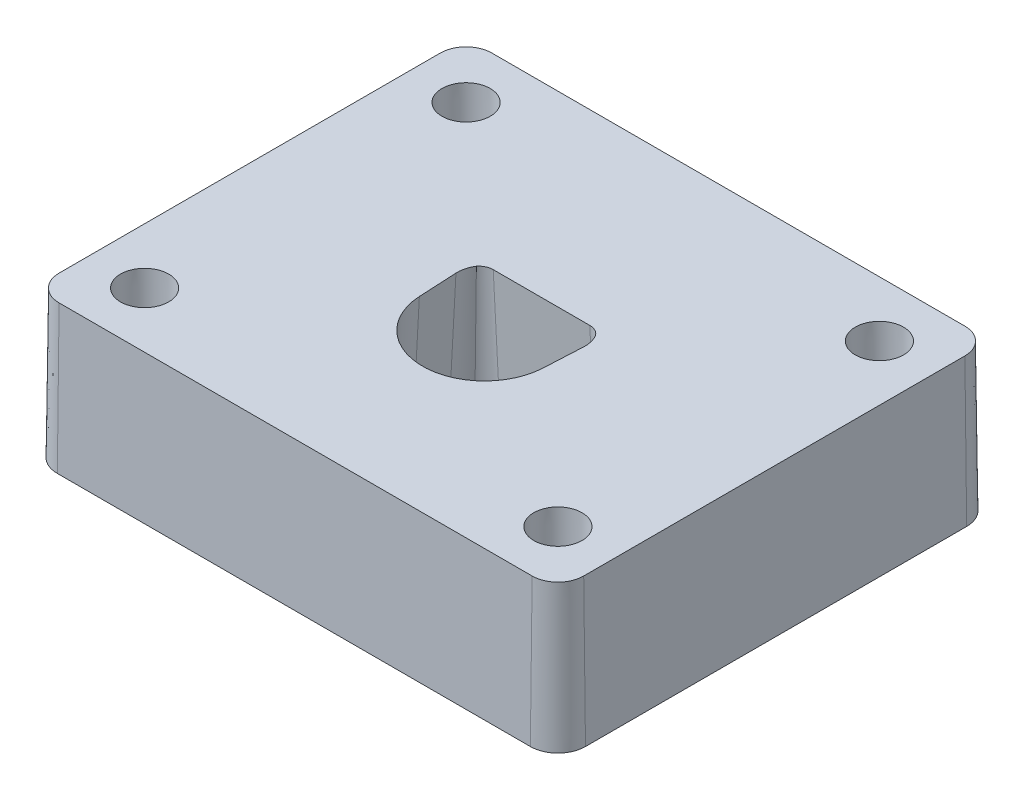
ISO-10303-21;
HEADER;
FILE_DESCRIPTION(('STEP AP214'),'2;1');
FILE_NAME('part.step','',(''),(''),'','','');
FILE_SCHEMA(('AUTOMOTIVE_DESIGN { 1 0 10303 214 1 1 1 1 }'));
ENDSEC;
DATA;
#1=APPLICATION_CONTEXT('core data for automotive mechanical design processes');
#2=APPLICATION_PROTOCOL_DEFINITION('international standard','automotive_design',2000,#1);
#3=PRODUCT_CONTEXT('',#1,'mechanical');
#4=PRODUCT('Part','Part','',(#3));
#5=PRODUCT_RELATED_PRODUCT_CATEGORY('part','',(#4));
#6=PRODUCT_DEFINITION_FORMATION('','',#4);
#7=PRODUCT_DEFINITION_CONTEXT('part definition',#1,'design');
#8=PRODUCT_DEFINITION('design','',#6,#7);
#9=PRODUCT_DEFINITION_SHAPE('','',#8);
#10=(LENGTH_UNIT() NAMED_UNIT(*) SI_UNIT(.MILLI.,.METRE.));
#11=(NAMED_UNIT(*) PLANE_ANGLE_UNIT() SI_UNIT($,.RADIAN.));
#12=(NAMED_UNIT(*) SI_UNIT($,.STERADIAN.) SOLID_ANGLE_UNIT());
#13=UNCERTAINTY_MEASURE_WITH_UNIT(LENGTH_MEASURE(1.E-05),#10,'distance_accuracy_value','');
#14=(GEOMETRIC_REPRESENTATION_CONTEXT(3) GLOBAL_UNCERTAINTY_ASSIGNED_CONTEXT((#13)) GLOBAL_UNIT_ASSIGNED_CONTEXT((#10,
#11,#12)) REPRESENTATION_CONTEXT('',''));
#15=CARTESIAN_POINT('',(0.,0.,0.));
#16=DIRECTION('',(0.,0.,1.));
#17=DIRECTION('',(1.,0.,0.));
#18=AXIS2_PLACEMENT_3D('',#15,#16,#17);
#19=CARTESIAN_POINT('',(-15.8372409470606,-6.04799999999998,-4.0345375495216));
#20=DIRECTION('',(0.,-1.,0.));
#21=DIRECTION('',(0.,0.,1.));
#22=AXIS2_PLACEMENT_3D('',#19,#20,#21);
#23=CONICAL_SURFACE('',#22,12.,0.05235987755983);
#24=CARTESIAN_POINT('',(-15.8372409470606,-70.,-4.03453754952161));
#25=DIRECTION('',(0.,-1.,0.));
#26=DIRECTION('',(0.,0.,-1.));
#27=AXIS2_PLACEMENT_3D('',#24,#25,#26);
#28=CIRCLE('',#27,15.3515823007091);
#29=CARTESIAN_POINT('',(-28.7038289065713,-70.,-12.408425142248));
#30=VERTEX_POINT('',#29);
#31=CARTESIAN_POINT('',(-31.16889808726,-70.,-3.25263699905656));
#32=VERTEX_POINT('',#31);
#33=EDGE_CURVE('E570',#30,#32,#28,.F.);
#34=ORIENTED_EDGE('',*,*,#33,.F.);
#35=CARTESIAN_POINT('',(-28.7038289065713,-70.,-12.408425142248));
#36=CARTESIAN_POINT('',(-28.4412529835568,-63.8630989320695,-12.2222553711423));
#37=CARTESIAN_POINT('',(-28.1787197317385,-57.7261987590171,-12.0359955744696));
#38=CARTESIAN_POINT('',(-27.5916285358123,-43.9990777446103,-11.619054822974));
#39=CARTESIAN_POINT('',(-27.2671055720176,-36.4088576486664,-11.3883000698534));
#40=CARTESIAN_POINT('',(-26.6183500865149,-21.2284236714312,-10.9261778182734));
#41=CARTESIAN_POINT('',(-26.2941175648081,-13.63820979014,-10.6948103198117));
#42=CARTESIAN_POINT('',(-25.9700744702565,-6.04799999999994,-10.4630431916761));
#43=B_SPLINE_CURVE_WITH_KNOTS('',3,(#35,#36,#37,#38,#39,#40,#41,#42),.UNSPECIFIED.,.F.,.F.,(4,2,
2,4),(0.,18.4360093514881,41.2379837187836,64.0399581734845),.UNSPECIFIED.);
#44=CARTESIAN_POINT('',(-25.9700744702586,-6.04799999999998,-10.4630431916717));
#45=VERTEX_POINT('',#44);
#46=EDGE_CURVE('E579',#30,#45,#43,.T.);
#47=ORIENTED_EDGE('',*,*,#46,.T.);
#48=CARTESIAN_POINT('',(-15.8372409470606,-6.04799999999998,-4.0345375495216));
#49=DIRECTION('',(0.,1.,0.));
#50=DIRECTION('',(0.,0.,1.));
#51=AXIS2_PLACEMENT_3D('',#48,#49,#50);
#52=CIRCLE('',#51,12.);
#53=CARTESIAN_POINT('',(-27.8216658798504,-6.04799999999998,-3.42334279306009));
#54=VERTEX_POINT('',#53);
#55=EDGE_CURVE('E475',#45,#54,#52,.T.);
#56=ORIENTED_EDGE('',*,*,#55,.T.);
#57=DIRECTION('',(0.0522680282399445,0.998629534754574,-0.00266562183584034));
#58=VECTOR('',#57,1.);
#59=CARTESIAN_POINT('',(-27.8216658798504,-6.04799999999998,-3.42334279306009));
#60=LINE('',#59,#58);
#61=EDGE_CURVE('E601',#32,#54,#60,.T.);
#62=ORIENTED_EDGE('',*,*,#61,.F.);
#63=EDGE_LOOP('',(#34,#47,#56,#62));
#64=FACE_BOUND('',#63,.T.);
#65=ADVANCED_FACE('F332',(#64),#23,.F.);
#66=CARTESIAN_POINT('',(15.8372409470606,-6.04799999999998,-4.0345375495216));
#67=DIRECTION('',(0.,-1.,0.));
#68=DIRECTION('',(0.,0.,1.));
#69=AXIS2_PLACEMENT_3D('',#66,#67,#68);
#70=CONICAL_SURFACE('',#69,12.,0.05235987755983);
#71=CARTESIAN_POINT('',(15.8372409470606,-6.04799999999998,-4.0345375495216));
#72=DIRECTION('',(0.,1.,0.));
#73=DIRECTION('',(0.,0.,1.));
#74=AXIS2_PLACEMENT_3D('',#71,#72,#73);
#75=CIRCLE('',#74,12.);
#76=CARTESIAN_POINT('',(27.8216658798504,-6.04799999999998,-3.42334279306009));
#77=VERTEX_POINT('',#76);
#78=CARTESIAN_POINT('',(25.9700744702775,-6.04799999999998,-10.4630431916418));
#79=VERTEX_POINT('',#78);
#80=EDGE_CURVE('E351',#77,#79,#75,.T.);
#81=ORIENTED_EDGE('',*,*,#80,.T.);
#82=CARTESIAN_POINT('',(25.9700744702775,-6.04799999999998,-10.4630431916418));
#83=CARTESIAN_POINT('',(26.1415464223363,-10.0645422813539,-10.585695222454));
#84=CARTESIAN_POINT('',(26.3130732448501,-14.0810857506776,-10.7082314948071));
#85=CARTESIAN_POINT('',(26.854165715338,-26.748017763147,-11.0943558569472));
#86=CARTESIAN_POINT('',(27.2239046764261,-35.3984100484164,-11.3575783123238));
#87=CARTESIAN_POINT('',(27.9636799325876,-52.6992010275075,-11.883395943513));
#88=CARTESIAN_POINT('',(28.3337162276627,-61.3495997213292,-12.1459911193217));
#89=CARTESIAN_POINT('',(28.7038289065965,-70.,-12.4084251422094));
#90=B_SPLINE_CURVE_WITH_KNOTS('',3,(#82,#83,#84,#85,#86,#87,#88,#89),.UNSPECIFIED.,.F.,.F.,(4,2,
2,4),(0.,12.0662140790843,38.0530860469535,64.0399581742362),.UNSPECIFIED.);
#91=CARTESIAN_POINT('',(28.7038289065965,-70.,-12.4084251422094));
#92=VERTEX_POINT('',#91);
#93=EDGE_CURVE('E572',#79,#92,#90,.T.);
#94=ORIENTED_EDGE('',*,*,#93,.T.);
#95=CARTESIAN_POINT('',(15.8372409470606,-70.,-4.03453754952161));
#96=DIRECTION('',(0.,-1.,0.));
#97=DIRECTION('',(0.,0.,-1.));
#98=AXIS2_PLACEMENT_3D('',#95,#96,#97);
#99=CIRCLE('',#98,15.3515823007091);
#100=CARTESIAN_POINT('',(31.16889808726,-70.,-3.25263699905656));
#101=VERTEX_POINT('',#100);
#102=EDGE_CURVE('E608',#101,#92,#99,.F.);
#103=ORIENTED_EDGE('',*,*,#102,.F.);
#104=DIRECTION('',(-0.0522680282399445,0.998629534754574,-0.00266562183584032));
#105=VECTOR('',#104,1.);
#106=CARTESIAN_POINT('',(27.8216658798504,-6.04799999999998,-3.42334279306009));
#107=LINE('',#106,#105);
#108=EDGE_CURVE('E386',#101,#77,#107,.T.);
#109=ORIENTED_EDGE('',*,*,#108,.T.);
#110=EDGE_LOOP('',(#81,#94,#103,#109));
#111=FACE_BOUND('',#110,.T.);
#112=ADVANCED_FACE('F581',(#111),#70,.F.);
#113=CARTESIAN_POINT('',(0.,-6.04799999999999,12.));
#114=DIRECTION('',(0.,-1.,0.));
#115=DIRECTION('',(0.,0.,1.));
#116=AXIS2_PLACEMENT_3D('',#113,#114,#115);
#117=CONICAL_SURFACE('',#116,27.,0.05235987755983);
#118=CARTESIAN_POINT('',(0.,-70.,12.));
#119=DIRECTION('',(0.,-1.,0.));
#120=DIRECTION('',(0.,0.,-1.));
#121=AXIS2_PLACEMENT_3D('',#118,#119,#120);
#122=CIRCLE('',#121,30.3515823007091);
#123=CARTESIAN_POINT('',(-30.3121883061866,-70.,13.5458939960419));
#124=VERTEX_POINT('',#123);
#125=CARTESIAN_POINT('',(30.3121883061866,-70.,13.5458939960419));
#126=VERTEX_POINT('',#125);
#127=EDGE_CURVE('E611',#124,#126,#122,.F.);
#128=ORIENTED_EDGE('',*,*,#127,.F.);
#129=DIRECTION('',(0.0522680282399445,0.998629534754574,-0.00266562183584034));
#130=VECTOR('',#129,1.);
#131=CARTESIAN_POINT('',(-26.9649560987771,-6.04799999999999,13.3751882020384));
#132=LINE('',#131,#130);
#133=CARTESIAN_POINT('',(-26.9649560987771,-6.04799999999999,13.3751882020384));
#134=VERTEX_POINT('',#133);
#135=EDGE_CURVE('E336',#134,#124,#132,.F.);
#136=ORIENTED_EDGE('',*,*,#135,.F.);
#137=CARTESIAN_POINT('',(0.,-6.04799999999999,12.));
#138=DIRECTION('',(0.,1.,0.));
#139=DIRECTION('',(0.,0.,1.));
#140=AXIS2_PLACEMENT_3D('',#137,#138,#139);
#141=CIRCLE('',#140,27.);
#142=CARTESIAN_POINT('',(26.9649560987771,-6.04799999999999,13.3751882020384));
#143=VERTEX_POINT('',#142);
#144=EDGE_CURVE('E566',#143,#134,#141,.F.);
#145=ORIENTED_EDGE('',*,*,#144,.F.);
#146=DIRECTION('',(-0.0522680282399445,0.998629534754574,-0.00266562183584036));
#147=VECTOR('',#146,1.);
#148=CARTESIAN_POINT('',(26.9649560987771,-6.04799999999999,13.3751882020384));
#149=LINE('',#148,#147);
#150=EDGE_CURVE('E390',#143,#126,#149,.F.);
#151=ORIENTED_EDGE('',*,*,#150,.T.);
#152=EDGE_LOOP('',(#128,#136,#145,#151));
#153=FACE_BOUND('',#152,.T.);
#154=ADVANCED_FACE('F633',(#153),#117,.F.);
#155=CARTESIAN_POINT('',(-26.9649560987771,-6.04799999999999,13.3751882020384));
#156=DIRECTION('',(0.997333391244417,-0.0523359562429439,-0.050863094607466));
#157=DIRECTION('',(0.0524037858632984,0.998625977644881,0.));
#158=AXIS2_PLACEMENT_3D('',#155,#156,#157);
#159=PLANE('',#158);
#160=ORIENTED_EDGE('',*,*,#61,.T.);
#161=DIRECTION('',(0.0509328963717924,0.,0.998702077732484));
#162=VECTOR('',#161,1.);
#163=CARTESIAN_POINT('',(-26.9649560987771,-6.04799999999999,13.3751882020384));
#164=LINE('',#163,#162);
#165=EDGE_CURVE('E563',#54,#134,#164,.T.);
#166=ORIENTED_EDGE('',*,*,#165,.T.);
#167=ORIENTED_EDGE('',*,*,#135,.T.);
#168=DIRECTION('',(0.0509328963717924,0.,0.998702077732484));
#169=VECTOR('',#168,1.);
#170=CARTESIAN_POINT('',(-26.9905907551422,-70.,78.6764208642607));
#171=LINE('',#170,#169);
#172=EDGE_CURVE('E600',#32,#124,#171,.T.);
#173=ORIENTED_EDGE('',*,*,#172,.F.);
#174=EDGE_LOOP('',(#160,#166,#167,#173));
#175=FACE_BOUND('',#174,.T.);
#176=ADVANCED_FACE('F626',(#175),#159,.T.);
#177=CARTESIAN_POINT('',(26.9649560987771,-6.04799999999999,13.3751882020384));
#178=DIRECTION('',(-0.997333391244417,-0.0523359562429439,-0.050863094607466));
#179=DIRECTION('',(0.0524037858632984,-0.998625977644881,0.));
#180=AXIS2_PLACEMENT_3D('',#177,#178,#179);
#181=PLANE('',#180);
#182=ORIENTED_EDGE('',*,*,#150,.F.);
#183=DIRECTION('',(0.0509328963717924,0.,-0.998702077732484));
#184=VECTOR('',#183,1.);
#185=CARTESIAN_POINT('',(26.9649560987771,-6.04799999999999,13.3751882020384));
#186=LINE('',#185,#184);
#187=EDGE_CURVE('E568',#143,#77,#186,.T.);
#188=ORIENTED_EDGE('',*,*,#187,.T.);
#189=ORIENTED_EDGE('',*,*,#108,.F.);
#190=DIRECTION('',(0.0509328963717924,0.,-0.998702077732484));
#191=VECTOR('',#190,1.);
#192=CARTESIAN_POINT('',(26.834941159173,-70.,81.7284282301472));
#193=LINE('',#192,#191);
#194=EDGE_CURVE('E614',#126,#101,#193,.T.);
#195=ORIENTED_EDGE('',*,*,#194,.F.);
#196=EDGE_LOOP('',(#182,#188,#189,#195));
#197=FACE_BOUND('',#196,.T.);
#198=ADVANCED_FACE('F623',(#197),#181,.T.);
#199=CARTESIAN_POINT('',(-30.,-3.,-94.1968223016897));
#200=DIRECTION('',(0.,-0.0119868655815672,0.999928154945909));
#201=DIRECTION('',(0.,-0.999928154945909,-0.0119868655815672));
#202=AXIS2_PLACEMENT_3D('',#199,#200,#201);
#203=PLANE('',#202);
#204=DIRECTION('',(0.,-0.999928154945909,-0.0119868655815688));
#205=VECTOR('',#204,1.);
#206=CARTESIAN_POINT('',(103.,-3.,-94.1968223016897));
#207=LINE('',#206,#205);
#208=CARTESIAN_POINT('',(103.,-6.04799999999997,-94.2333608930994));
#209=VERTEX_POINT('',#208);
#210=CARTESIAN_POINT('',(103.,-70.,-95.));
#211=VERTEX_POINT('',#210);
#212=EDGE_CURVE('E519',#209,#211,#207,.T.);
#213=ORIENTED_EDGE('',*,*,#212,.T.);
#214=DIRECTION('',(1.,0.,0.));
#215=VECTOR('',#214,1.);
#216=CARTESIAN_POINT('',(-103.,-70.,-95.));
#217=LINE('',#216,#215);
#218=CARTESIAN_POINT('',(-103.,-70.,-95.));
#219=VERTEX_POINT('',#218);
#220=EDGE_CURVE('E522',#219,#211,#217,.T.);
#221=ORIENTED_EDGE('',*,*,#220,.F.);
#222=DIRECTION('',(0.,-0.999928154945909,-0.0119868655815688));
#223=VECTOR('',#222,1.);
#224=CARTESIAN_POINT('',(-103.,-3.,-94.1968223016896));
#225=LINE('',#224,#223);
#226=CARTESIAN_POINT('',(-103.,-6.04799999999997,-94.2333608930993));
#227=VERTEX_POINT('',#226);
#228=EDGE_CURVE('E513',#227,#219,#225,.T.);
#229=ORIENTED_EDGE('',*,*,#228,.F.);
#230=DIRECTION('',(1.,0.,0.));
#231=VECTOR('',#230,1.);
#232=CARTESIAN_POINT('',(-30.0000000000001,-6.04799999999997,-94.2333608930994));
#233=LINE('',#232,#231);
#234=EDGE_CURVE('E13',#227,#209,#233,.T.);
#235=ORIENTED_EDGE('',*,*,#234,.T.);
#236=EDGE_LOOP('',(#213,#221,#229,#235));
#237=FACE_BOUND('',#236,.T.);
#238=ADVANCED_FACE('F625',(#237),#203,.F.);
#239=CARTESIAN_POINT('',(-30.,-70.,78.8298979948547));
#240=DIRECTION('',(0.,-1.,0.));
#241=DIRECTION('',(0.,0.,-1.));
#242=AXIS2_PLACEMENT_3D('',#239,#240,#241);
#243=PLANE('',#242);
#244=CARTESIAN_POINT('',(-21.0196270396129,-70.,-6.48799150436215));
#245=DIRECTION('',(0.,-1.,0.));
#246=DIRECTION('',(0.,0.,-1.));
#247=AXIS2_PLACEMENT_3D('',#244,#245,#246);
#248=CIRCLE('',#247,9.70043776294546);
#249=CARTESIAN_POINT('',(-21.0194554633095,-70.,-16.1884292657902));
#250=VERTEX_POINT('',#249);
#251=EDGE_CURVE('E459',#250,#30,#248,.F.);
#252=ORIENTED_EDGE('',*,*,#251,.T.);
#253=ORIENTED_EDGE('',*,*,#33,.T.);
#254=ORIENTED_EDGE('',*,*,#172,.T.);
#255=ORIENTED_EDGE('',*,*,#127,.T.);
#256=ORIENTED_EDGE('',*,*,#194,.T.);
#257=ORIENTED_EDGE('',*,*,#102,.T.);
#258=CARTESIAN_POINT('',(21.0196270395921,-70.,-6.4879915043294));
#259=DIRECTION('',(0.,-1.,0.));
#260=DIRECTION('',(0.,0.,-1.));
#261=AXIS2_PLACEMENT_3D('',#258,#259,#260);
#262=CIRCLE('',#261,9.7004377629782);
#263=CARTESIAN_POINT('',(21.019514744356,-70.,-16.1884292663145));
#264=VERTEX_POINT('',#263);
#265=EDGE_CURVE('E480',#92,#264,#262,.F.);
#266=ORIENTED_EDGE('',*,*,#265,.T.);
#267=DIRECTION('',(1.,0.,0.));
#268=VECTOR('',#267,1.);
#269=CARTESIAN_POINT('',(-21.0195147443559,-70.,-16.1884292663145));
#270=LINE('',#269,#268);
#271=EDGE_CURVE('E604',#264,#250,#270,.F.);
#272=ORIENTED_EDGE('',*,*,#271,.T.);
#273=EDGE_LOOP('',(#252,#253,#254,#255,#256,#257,#266,#272));
#274=FACE_BOUND('',#273,.T.);
#275=DIRECTION('',(0.,0.,1.));
#276=VECTOR('',#275,1.);
#277=CARTESIAN_POINT('',(115.,-70.,-83.));
#278=LINE('',#277,#276);
#279=CARTESIAN_POINT('',(115.,-70.,-83.));
#280=VERTEX_POINT('',#279);
#281=CARTESIAN_POINT('',(115.,-70.,83.));
#282=VERTEX_POINT('',#281);
#283=EDGE_CURVE('E534',#280,#282,#278,.T.);
#284=ORIENTED_EDGE('',*,*,#283,.T.);
#285=CARTESIAN_POINT('',(103.,-70.,83.));
#286=DIRECTION('',(0.,-1.,0.));
#287=DIRECTION('',(0.,0.,-1.));
#288=AXIS2_PLACEMENT_3D('',#285,#286,#287);
#289=CIRCLE('',#288,12.);
#290=CARTESIAN_POINT('',(103.,-70.,95.));
#291=VERTEX_POINT('',#290);
#292=EDGE_CURVE('E540',#282,#291,#289,.T.);
#293=ORIENTED_EDGE('',*,*,#292,.T.);
#294=DIRECTION('',(1.,0.,0.));
#295=VECTOR('',#294,1.);
#296=CARTESIAN_POINT('',(-103.,-70.,95.));
#297=LINE('',#296,#295);
#298=CARTESIAN_POINT('',(-103.,-70.,95.));
#299=VERTEX_POINT('',#298);
#300=EDGE_CURVE('E500',#299,#291,#297,.T.);
#301=ORIENTED_EDGE('',*,*,#300,.F.);
#302=CARTESIAN_POINT('',(-103.,-70.,83.));
#303=DIRECTION('',(0.,-1.,0.));
#304=DIRECTION('',(0.,0.,-1.));
#305=AXIS2_PLACEMENT_3D('',#302,#303,#304);
#306=CIRCLE('',#305,12.);
#307=CARTESIAN_POINT('',(-115.,-70.,83.));
#308=VERTEX_POINT('',#307);
#309=EDGE_CURVE('E505',#299,#308,#306,.T.);
#310=ORIENTED_EDGE('',*,*,#309,.T.);
#311=DIRECTION('',(0.,0.,-1.));
#312=VECTOR('',#311,1.);
#313=CARTESIAN_POINT('',(-115.,-70.,83.));
#314=LINE('',#313,#312);
#315=CARTESIAN_POINT('',(-115.,-70.,-83.));
#316=VERTEX_POINT('',#315);
#317=EDGE_CURVE('E511',#308,#316,#314,.T.);
#318=ORIENTED_EDGE('',*,*,#317,.T.);
#319=CARTESIAN_POINT('',(-103.,-70.,-83.));
#320=DIRECTION('',(0.,-1.,0.));
#321=DIRECTION('',(0.,0.,-1.));
#322=AXIS2_PLACEMENT_3D('',#319,#320,#321);
#323=CIRCLE('',#322,12.);
#324=EDGE_CURVE('E517',#316,#219,#323,.T.);
#325=ORIENTED_EDGE('',*,*,#324,.T.);
#326=ORIENTED_EDGE('',*,*,#220,.T.);
#327=CARTESIAN_POINT('',(103.,-70.,-83.));
#328=DIRECTION('',(0.,-1.,0.));
#329=DIRECTION('',(0.,0.,-1.));
#330=AXIS2_PLACEMENT_3D('',#327,#328,#329);
#331=CIRCLE('',#330,12.);
#332=EDGE_CURVE('E528',#211,#280,#331,.T.);
#333=ORIENTED_EDGE('',*,*,#332,.T.);
#334=EDGE_LOOP('',(#284,#293,#301,#310,#318,#325,#326,#333));
#335=FACE_BOUND('',#334,.T.);
#336=CARTESIAN_POINT('',(-90.,-70.,-70.));
#337=DIRECTION('',(0.,-1.,0.));
#338=DIRECTION('',(0.,0.,1.));
#339=AXIS2_PLACEMENT_3D('',#336,#337,#338);
#340=CIRCLE('',#339,8.5);
#341=CARTESIAN_POINT('',(-90.,-70.,-61.5));
#342=VERTEX_POINT('',#341);
#343=EDGE_CURVE('E486',#342,#342,#340,.T.);
#344=ORIENTED_EDGE('',*,*,#343,.F.);
#345=EDGE_LOOP('',(#344));
#346=FACE_BOUND('',#345,.T.);
#347=CARTESIAN_POINT('',(90.,-70.,-70.));
#348=DIRECTION('',(0.,1.,0.));
#349=DIRECTION('',(0.,0.,1.));
#350=AXIS2_PLACEMENT_3D('',#347,#348,#349);
#351=CIRCLE('',#350,8.5);
#352=CARTESIAN_POINT('',(90.,-70.,-61.5));
#353=VERTEX_POINT('',#352);
#354=EDGE_CURVE('E494',#353,#353,#351,.T.);
#355=ORIENTED_EDGE('',*,*,#354,.T.);
#356=EDGE_LOOP('',(#355));
#357=FACE_BOUND('',#356,.T.);
#358=CARTESIAN_POINT('',(-90.,-70.,70.));
#359=DIRECTION('',(0.,1.,0.));
#360=DIRECTION('',(0.,0.,-1.));
#361=AXIS2_PLACEMENT_3D('',#358,#359,#360);
#362=CIRCLE('',#361,8.5);
#363=CARTESIAN_POINT('',(-90.,-70.,61.5));
#364=VERTEX_POINT('',#363);
#365=EDGE_CURVE('E481',#364,#364,#362,.T.);
#366=ORIENTED_EDGE('',*,*,#365,.T.);
#367=EDGE_LOOP('',(#366));
#368=FACE_BOUND('',#367,.T.);
#369=CARTESIAN_POINT('',(90.,-70.,70.));
#370=DIRECTION('',(0.,-1.,0.));
#371=DIRECTION('',(0.,0.,-1.));
#372=AXIS2_PLACEMENT_3D('',#369,#370,#371);
#373=CIRCLE('',#372,8.5);
#374=CARTESIAN_POINT('',(90.,-70.,61.5));
#375=VERTEX_POINT('',#374);
#376=EDGE_CURVE('E490',#375,#375,#373,.T.);
#377=ORIENTED_EDGE('',*,*,#376,.F.);
#378=EDGE_LOOP('',(#377));
#379=FACE_BOUND('',#378,.T.);
#380=ADVANCED_FACE('F621',(#274,#335,#346,#357,#368,#379),#243,.T.);
#381=CARTESIAN_POINT('',(-30.,-3.,94.1968223016897));
#382=DIRECTION('',(0.,0.0119868655815671,0.999928154945909));
#383=DIRECTION('',(0.,-0.999928154945909,0.0119868655815671));
#384=AXIS2_PLACEMENT_3D('',#381,#382,#383);
#385=PLANE('',#384);
#386=ORIENTED_EDGE('',*,*,#300,.T.);
#387=DIRECTION('',(0.,-0.999928154945909,0.0119868655815688));
#388=VECTOR('',#387,1.);
#389=CARTESIAN_POINT('',(103.,-3.,94.1968223016897));
#390=LINE('',#389,#388);
#391=CARTESIAN_POINT('',(103.,-6.048,94.2333608930994));
#392=VERTEX_POINT('',#391);
#393=EDGE_CURVE('E536',#392,#291,#390,.T.);
#394=ORIENTED_EDGE('',*,*,#393,.F.);
#395=DIRECTION('',(1.,0.,0.));
#396=VECTOR('',#395,1.);
#397=CARTESIAN_POINT('',(-30.,-6.048,94.2333608930994));
#398=LINE('',#397,#396);
#399=CARTESIAN_POINT('',(-103.,-6.048,94.2333608930994));
#400=VERTEX_POINT('',#399);
#401=EDGE_CURVE('E342',#400,#392,#398,.T.);
#402=ORIENTED_EDGE('',*,*,#401,.F.);
#403=DIRECTION('',(0.,-0.999928154945909,0.0119868655815688));
#404=VECTOR('',#403,1.);
#405=CARTESIAN_POINT('',(-103.,-3.,94.1968223016897));
#406=LINE('',#405,#404);
#407=EDGE_CURVE('E497',#400,#299,#406,.T.);
#408=ORIENTED_EDGE('',*,*,#407,.T.);
#409=EDGE_LOOP('',(#386,#394,#402,#408));
#410=FACE_BOUND('',#409,.T.);
#411=ADVANCED_FACE('F764',(#410),#385,.T.);
#412=CARTESIAN_POINT('',(103.,-3.,83.));
#413=DIRECTION('',(0.,-1.,0.));
#414=DIRECTION('',(0.,0.,-1.));
#415=AXIS2_PLACEMENT_3D('',#412,#413,#414);
#416=CONICAL_SURFACE('',#415,11.1968223016897,0.0119871526554874);
#417=ORIENTED_EDGE('',*,*,#393,.T.);
#418=ORIENTED_EDGE('',*,*,#292,.F.);
#419=DIRECTION('',(0.0119868655815688,-0.999928154945909,0.));
#420=VECTOR('',#419,1.);
#421=CARTESIAN_POINT('',(114.19682230169,-3.,83.));
#422=LINE('',#421,#420);
#423=CARTESIAN_POINT('',(114.233360893099,-6.048,83.));
#424=VERTEX_POINT('',#423);
#425=EDGE_CURVE('E530',#424,#282,#422,.T.);
#426=ORIENTED_EDGE('',*,*,#425,.F.);
#427=CARTESIAN_POINT('',(103.,-6.048,83.));
#428=DIRECTION('',(0.,1.,0.));
#429=DIRECTION('',(0.,0.,1.));
#430=AXIS2_PLACEMENT_3D('',#427,#428,#429);
#431=CIRCLE('',#430,11.2333608930994);
#432=EDGE_CURVE('E539',#424,#392,#431,.F.);
#433=ORIENTED_EDGE('',*,*,#432,.T.);
#434=EDGE_LOOP('',(#417,#418,#426,#433));
#435=FACE_BOUND('',#434,.T.);
#436=ADVANCED_FACE('F754',(#435),#416,.T.);
#437=CARTESIAN_POINT('',(114.19682230169,-3.,-83.));
#438=DIRECTION('',(-0.999928154945909,-0.0119868655815688,0.));
#439=DIRECTION('',(0.0119868655815688,-0.999928154945909,0.));
#440=AXIS2_PLACEMENT_3D('',#437,#438,#439);
#441=PLANE('',#440);
#442=ORIENTED_EDGE('',*,*,#425,.T.);
#443=ORIENTED_EDGE('',*,*,#283,.F.);
#444=DIRECTION('',(0.0119868655815688,-0.999928154945909,0.));
#445=VECTOR('',#444,1.);
#446=CARTESIAN_POINT('',(114.19682230169,-3.,-83.));
#447=LINE('',#446,#445);
#448=CARTESIAN_POINT('',(114.233360893099,-6.04799999999997,-83.));
#449=VERTEX_POINT('',#448);
#450=EDGE_CURVE('E524',#449,#280,#447,.T.);
#451=ORIENTED_EDGE('',*,*,#450,.F.);
#452=DIRECTION('',(0.,0.,1.));
#453=VECTOR('',#452,1.);
#454=CARTESIAN_POINT('',(114.233360893099,-6.048,81.4465175295403));
#455=LINE('',#454,#453);
#456=EDGE_CURVE('E533',#449,#424,#455,.T.);
#457=ORIENTED_EDGE('',*,*,#456,.T.);
#458=EDGE_LOOP('',(#442,#443,#451,#457));
#459=FACE_BOUND('',#458,.T.);
#460=ADVANCED_FACE('F743',(#459),#441,.F.);
#461=CARTESIAN_POINT('',(103.,-3.,-83.));
#462=DIRECTION('',(0.,-1.,0.));
#463=DIRECTION('',(0.,0.,-1.));
#464=AXIS2_PLACEMENT_3D('',#461,#462,#463);
#465=CONICAL_SURFACE('',#464,11.1968223016897,0.0119871526554874);
#466=ORIENTED_EDGE('',*,*,#450,.T.);
#467=ORIENTED_EDGE('',*,*,#332,.F.);
#468=ORIENTED_EDGE('',*,*,#212,.F.);
#469=CARTESIAN_POINT('',(103.,-6.04799999999997,-83.));
#470=DIRECTION('',(0.,1.,0.));
#471=DIRECTION('',(0.,0.,1.));
#472=AXIS2_PLACEMENT_3D('',#469,#470,#471);
#473=CIRCLE('',#472,11.2333608930994);
#474=EDGE_CURVE('E527',#209,#449,#473,.F.);
#475=ORIENTED_EDGE('',*,*,#474,.T.);
#476=EDGE_LOOP('',(#466,#467,#468,#475));
#477=FACE_BOUND('',#476,.T.);
#478=ADVANCED_FACE('F733',(#477),#465,.T.);
#479=CARTESIAN_POINT('',(-103.,-3.,-83.));
#480=DIRECTION('',(0.,-1.,0.));
#481=DIRECTION('',(0.,0.,-1.));
#482=AXIS2_PLACEMENT_3D('',#479,#480,#481);
#483=CONICAL_SURFACE('',#482,11.1968223016897,0.0119871526554874);
#484=ORIENTED_EDGE('',*,*,#228,.T.);
#485=ORIENTED_EDGE('',*,*,#324,.F.);
#486=DIRECTION('',(-0.0119868655815688,-0.999928154945909,0.));
#487=VECTOR('',#486,1.);
#488=CARTESIAN_POINT('',(-114.19682230169,-3.,-83.));
#489=LINE('',#488,#487);
#490=CARTESIAN_POINT('',(-114.233360893099,-6.04799999999997,-83.));
#491=VERTEX_POINT('',#490);
#492=EDGE_CURVE('E507',#491,#316,#489,.T.);
#493=ORIENTED_EDGE('',*,*,#492,.F.);
#494=CARTESIAN_POINT('',(-103.,-6.04799999999997,-83.));
#495=DIRECTION('',(0.,1.,0.));
#496=DIRECTION('',(0.,0.,1.));
#497=AXIS2_PLACEMENT_3D('',#494,#495,#496);
#498=CIRCLE('',#497,11.2333608930994);
#499=EDGE_CURVE('E516',#491,#227,#498,.F.);
#500=ORIENTED_EDGE('',*,*,#499,.T.);
#501=EDGE_LOOP('',(#484,#485,#493,#500));
#502=FACE_BOUND('',#501,.T.);
#503=ADVANCED_FACE('F723',(#502),#483,.T.);
#504=CARTESIAN_POINT('',(-114.19682230169,-3.,83.));
#505=DIRECTION('',(0.999928154945909,-0.0119868655815688,0.));
#506=DIRECTION('',(0.0119868655815688,0.999928154945909,0.));
#507=AXIS2_PLACEMENT_3D('',#504,#505,#506);
#508=PLANE('',#507);
#509=ORIENTED_EDGE('',*,*,#492,.T.);
#510=ORIENTED_EDGE('',*,*,#317,.F.);
#511=DIRECTION('',(-0.0119868655815688,-0.999928154945909,0.));
#512=VECTOR('',#511,1.);
#513=CARTESIAN_POINT('',(-114.19682230169,-3.,83.));
#514=LINE('',#513,#512);
#515=CARTESIAN_POINT('',(-114.233360893099,-6.048,83.));
#516=VERTEX_POINT('',#515);
#517=EDGE_CURVE('E501',#516,#308,#514,.T.);
#518=ORIENTED_EDGE('',*,*,#517,.F.);
#519=DIRECTION('',(0.,0.,-1.));
#520=VECTOR('',#519,1.);
#521=CARTESIAN_POINT('',(-114.233360893099,-6.048,81.4465175295403));
#522=LINE('',#521,#520);
#523=EDGE_CURVE('E510',#516,#491,#522,.T.);
#524=ORIENTED_EDGE('',*,*,#523,.T.);
#525=EDGE_LOOP('',(#509,#510,#518,#524));
#526=FACE_BOUND('',#525,.T.);
#527=ADVANCED_FACE('F713',(#526),#508,.F.);
#528=CARTESIAN_POINT('',(-103.,-3.,83.));
#529=DIRECTION('',(0.,-1.,0.));
#530=DIRECTION('',(0.,0.,-1.));
#531=AXIS2_PLACEMENT_3D('',#528,#529,#530);
#532=CONICAL_SURFACE('',#531,11.1968223016897,0.0119871526554874);
#533=ORIENTED_EDGE('',*,*,#517,.T.);
#534=ORIENTED_EDGE('',*,*,#309,.F.);
#535=ORIENTED_EDGE('',*,*,#407,.F.);
#536=CARTESIAN_POINT('',(-103.,-6.048,83.));
#537=DIRECTION('',(0.,1.,0.));
#538=DIRECTION('',(0.,0.,1.));
#539=AXIS2_PLACEMENT_3D('',#536,#537,#538);
#540=CIRCLE('',#539,11.2333608930994);
#541=EDGE_CURVE('E504',#400,#516,#540,.F.);
#542=ORIENTED_EDGE('',*,*,#541,.T.);
#543=EDGE_LOOP('',(#533,#534,#535,#542));
#544=FACE_BOUND('',#543,.T.);
#545=ADVANCED_FACE('F703',(#544),#532,.T.);
#546=CARTESIAN_POINT('',(90.,-70.,-70.));
#547=DIRECTION('',(0.,1.,0.));
#548=DIRECTION('',(0.,0.,1.));
#549=AXIS2_PLACEMENT_3D('',#546,#547,#548);
#550=CONICAL_SURFACE('',#549,8.5,0.0313669654297439);
#551=ORIENTED_EDGE('',*,*,#354,.F.);
#552=EDGE_LOOP('',(#551));
#553=FACE_BOUND('',#552,.T.);
#554=CARTESIAN_POINT('',(90.,-6.04799999999997,-70.));
#555=DIRECTION('',(0.,1.,0.));
#556=DIRECTION('',(0.,0.,1.));
#557=AXIS2_PLACEMENT_3D('',#554,#555,#556);
#558=CIRCLE('',#557,10.5066383177975);
#559=CARTESIAN_POINT('',(90.,-6.04799999999997,-59.4933616822025));
#560=VERTEX_POINT('',#559);
#561=EDGE_CURVE('E493',#560,#560,#558,.T.);
#562=ORIENTED_EDGE('',*,*,#561,.T.);
#563=EDGE_LOOP('',(#562));
#564=FACE_BOUND('',#563,.T.);
#565=ADVANCED_FACE('F693',(#553,#564),#550,.F.);
#566=CARTESIAN_POINT('',(90.,-70.,70.));
#567=DIRECTION('',(0.,1.,0.));
#568=DIRECTION('',(0.,0.,-1.));
#569=AXIS2_PLACEMENT_3D('',#566,#567,#568);
#570=CONICAL_SURFACE('',#569,8.5,0.0313669654297439);
#571=ORIENTED_EDGE('',*,*,#376,.T.);
#572=EDGE_LOOP('',(#571));
#573=FACE_BOUND('',#572,.T.);
#574=CARTESIAN_POINT('',(90.,-6.048,70.));
#575=DIRECTION('',(0.,1.,0.));
#576=DIRECTION('',(0.,0.,1.));
#577=AXIS2_PLACEMENT_3D('',#574,#575,#576);
#578=CIRCLE('',#577,10.5066383177975);
#579=CARTESIAN_POINT('',(90.,-6.048,80.5066383177975));
#580=VERTEX_POINT('',#579);
#581=EDGE_CURVE('E489',#580,#580,#578,.F.);
#582=ORIENTED_EDGE('',*,*,#581,.F.);
#583=EDGE_LOOP('',(#582));
#584=FACE_BOUND('',#583,.T.);
#585=ADVANCED_FACE('F683',(#573,#584),#570,.F.);
#586=CARTESIAN_POINT('',(-90.,-70.,-70.));
#587=DIRECTION('',(0.,1.,0.));
#588=DIRECTION('',(0.,0.,1.));
#589=AXIS2_PLACEMENT_3D('',#586,#587,#588);
#590=CONICAL_SURFACE('',#589,8.5,0.0313669654297439);
#591=ORIENTED_EDGE('',*,*,#343,.T.);
#592=EDGE_LOOP('',(#591));
#593=FACE_BOUND('',#592,.T.);
#594=CARTESIAN_POINT('',(-90.,-6.04799999999997,-70.));
#595=DIRECTION('',(0.,1.,0.));
#596=DIRECTION('',(0.,0.,1.));
#597=AXIS2_PLACEMENT_3D('',#594,#595,#596);
#598=CIRCLE('',#597,10.5066383177975);
#599=CARTESIAN_POINT('',(-90.,-6.04799999999997,-59.4933616822025));
#600=VERTEX_POINT('',#599);
#601=EDGE_CURVE('E484',#600,#600,#598,.F.);
#602=ORIENTED_EDGE('',*,*,#601,.F.);
#603=EDGE_LOOP('',(#602));
#604=FACE_BOUND('',#603,.T.);
#605=ADVANCED_FACE('F672',(#593,#604),#590,.F.);
#606=CARTESIAN_POINT('',(-90.,-70.,70.));
#607=DIRECTION('',(0.,1.,0.));
#608=DIRECTION('',(0.,0.,-1.));
#609=AXIS2_PLACEMENT_3D('',#606,#607,#608);
#610=CONICAL_SURFACE('',#609,8.5,0.0313669654297439);
#611=ORIENTED_EDGE('',*,*,#365,.F.);
#612=EDGE_LOOP('',(#611));
#613=FACE_BOUND('',#612,.T.);
#614=CARTESIAN_POINT('',(-90.,-6.048,70.));
#615=DIRECTION('',(0.,1.,0.));
#616=DIRECTION('',(0.,0.,1.));
#617=AXIS2_PLACEMENT_3D('',#614,#615,#616);
#618=CIRCLE('',#617,10.5066383177975);
#619=CARTESIAN_POINT('',(-90.,-6.048,80.5066383177975));
#620=VERTEX_POINT('',#619);
#621=EDGE_CURVE('E485',#620,#620,#618,.T.);
#622=ORIENTED_EDGE('',*,*,#621,.T.);
#623=EDGE_LOOP('',(#622));
#624=FACE_BOUND('',#623,.T.);
#625=ADVANCED_FACE('F661',(#613,#624),#610,.F.);
#626=CARTESIAN_POINT('',(-30.,-6.048,81.4465175295403));
#627=DIRECTION('',(0.,1.,0.));
#628=DIRECTION('',(0.,0.,1.));
#629=AXIS2_PLACEMENT_3D('',#626,#627,#628);
#630=PLANE('',#629);
#631=ORIENTED_EDGE('',*,*,#55,.F.);
#632=CARTESIAN_POINT('',(-21.0196270396129,-6.04799999999998,-6.48799150436213));
#633=DIRECTION('',(0.,1.,0.));
#634=DIRECTION('',(0.,0.,1.));
#635=AXIS2_PLACEMENT_3D('',#632,#633,#634);
#636=CIRCLE('',#635,6.3488554622364);
#637=CARTESIAN_POINT('',(-21.0195147443559,-6.04799999999998,-12.8368469656054));
#638=VERTEX_POINT('',#637);
#639=EDGE_CURVE('E456',#638,#45,#636,.T.);
#640=ORIENTED_EDGE('',*,*,#639,.F.);
#641=DIRECTION('',(-1.,0.,0.));
#642=VECTOR('',#641,1.);
#643=CARTESIAN_POINT('',(-21.0195147443559,-6.04799999999998,-12.8368469656054));
#644=LINE('',#643,#642);
#645=CARTESIAN_POINT('',(21.0195147443559,-6.04799999999998,-12.8368469656054));
#646=VERTEX_POINT('',#645);
#647=EDGE_CURVE('E466',#646,#638,#644,.T.);
#648=ORIENTED_EDGE('',*,*,#647,.F.);
#649=CARTESIAN_POINT('',(21.0196270395921,-6.04799999999998,-6.48799150432939));
#650=DIRECTION('',(0.,1.,0.));
#651=DIRECTION('',(0.,0.,1.));
#652=AXIS2_PLACEMENT_3D('',#649,#650,#651);
#653=CIRCLE('',#652,6.34885546226915);
#654=EDGE_CURVE('E469',#79,#646,#653,.T.);
#655=ORIENTED_EDGE('',*,*,#654,.F.);
#656=ORIENTED_EDGE('',*,*,#80,.F.);
#657=ORIENTED_EDGE('',*,*,#187,.F.);
#658=ORIENTED_EDGE('',*,*,#144,.T.);
#659=ORIENTED_EDGE('',*,*,#165,.F.);
#660=EDGE_LOOP('',(#631,#640,#648,#655,#656,#657,#658,#659));
#661=FACE_BOUND('',#660,.T.);
#662=ORIENTED_EDGE('',*,*,#581,.T.);
#663=EDGE_LOOP('',(#662));
#664=FACE_BOUND('',#663,.T.);
#665=ORIENTED_EDGE('',*,*,#621,.F.);
#666=EDGE_LOOP('',(#665));
#667=FACE_BOUND('',#666,.T.);
#668=ORIENTED_EDGE('',*,*,#561,.F.);
#669=EDGE_LOOP('',(#668));
#670=FACE_BOUND('',#669,.T.);
#671=ORIENTED_EDGE('',*,*,#601,.T.);
#672=EDGE_LOOP('',(#671));
#673=FACE_BOUND('',#672,.T.);
#674=ORIENTED_EDGE('',*,*,#499,.F.);
#675=ORIENTED_EDGE('',*,*,#523,.F.);
#676=ORIENTED_EDGE('',*,*,#541,.F.);
#677=ORIENTED_EDGE('',*,*,#401,.T.);
#678=ORIENTED_EDGE('',*,*,#432,.F.);
#679=ORIENTED_EDGE('',*,*,#456,.F.);
#680=ORIENTED_EDGE('',*,*,#474,.F.);
#681=ORIENTED_EDGE('',*,*,#234,.F.);
#682=EDGE_LOOP('',(#674,#675,#676,#677,#678,#679,#680,#681));
#683=FACE_BOUND('',#682,.T.);
#684=ADVANCED_FACE('F472',(#661,#664,#667,#670,#673,#683),#630,.T.);
#685=CARTESIAN_POINT('',(-21.0196270396129,-6.04799999999998,-6.48799150436213));
#686=DIRECTION('',(0.,-1.,0.));
#687=DIRECTION('',(0.,0.,1.));
#688=AXIS2_PLACEMENT_3D('',#685,#686,#687);
#689=CONICAL_SURFACE('',#688,6.3488554622364,0.05235987755983);
#690=ORIENTED_EDGE('',*,*,#46,.F.);
#691=ORIENTED_EDGE('',*,*,#251,.F.);
#692=DIRECTION('',(-9.25691203389086E-07,0.998629534754574,0.0523359562347575));
#693=VECTOR('',#692,1.);
#694=CARTESIAN_POINT('',(-21.0195147443559,-6.04799999999998,-12.8368469656054));
#695=LINE('',#694,#693);
#696=EDGE_CURVE('E452',#250,#638,#695,.T.);
#697=ORIENTED_EDGE('',*,*,#696,.T.);
#698=ORIENTED_EDGE('',*,*,#639,.T.);
#699=EDGE_LOOP('',(#690,#691,#697,#698));
#700=FACE_BOUND('',#699,.T.);
#701=ADVANCED_FACE('F454',(#700),#689,.F.);
#702=CARTESIAN_POINT('',(-21.0195147443559,-6.04799999999998,-12.8368469656054));
#703=DIRECTION('',(0.,-0.0523359562429441,0.998629534754574));
#704=DIRECTION('',(0.,-0.998629534754574,-0.0523359562429441));
#705=AXIS2_PLACEMENT_3D('',#702,#703,#704);
#706=PLANE('',#705);
#707=ORIENTED_EDGE('',*,*,#271,.F.);
#708=DIRECTION('',(0.,0.998629534754574,0.0523359562429441));
#709=VECTOR('',#708,1.);
#710=CARTESIAN_POINT('',(21.019514744356,-6.04799999999998,-12.8368469656054));
#711=LINE('',#710,#709);
#712=EDGE_CURVE('E468',#264,#646,#711,.T.);
#713=ORIENTED_EDGE('',*,*,#712,.T.);
#714=ORIENTED_EDGE('',*,*,#647,.T.);
#715=ORIENTED_EDGE('',*,*,#696,.F.);
#716=EDGE_LOOP('',(#707,#713,#714,#715));
#717=FACE_BOUND('',#716,.T.);
#718=ADVANCED_FACE('F334',(#717),#706,.T.);
#719=CARTESIAN_POINT('',(21.0196270395921,-6.04799999999998,-6.48799150432939));
#720=DIRECTION('',(0.,-1.,0.));
#721=DIRECTION('',(0.,0.,1.));
#722=AXIS2_PLACEMENT_3D('',#719,#720,#721);
#723=CONICAL_SURFACE('',#722,6.34885546226915,0.05235987755983);
#724=ORIENTED_EDGE('',*,*,#93,.F.);
#725=ORIENTED_EDGE('',*,*,#654,.T.);
#726=ORIENTED_EDGE('',*,*,#712,.F.);
#727=ORIENTED_EDGE('',*,*,#265,.F.);
#728=EDGE_LOOP('',(#724,#725,#726,#727));
#729=FACE_BOUND('',#728,.T.);
#730=ADVANCED_FACE('F584',(#729),#723,.F.);
#731=CLOSED_SHELL('',(#65,#112,#154,#176,#198,#238,#380,#411,#436,#460,#478,#503,#527,#545,#565,
#585,#605,#625,#684,#701,#718,#730));
#732=MANIFOLD_SOLID_BREP('B2',#731);
#733=ADVANCED_BREP_SHAPE_REPRESENTATION('',(#18,#732),#14);
#734=SHAPE_DEFINITION_REPRESENTATION(#9,#733);
ENDSEC;
END-ISO-10303-21;
